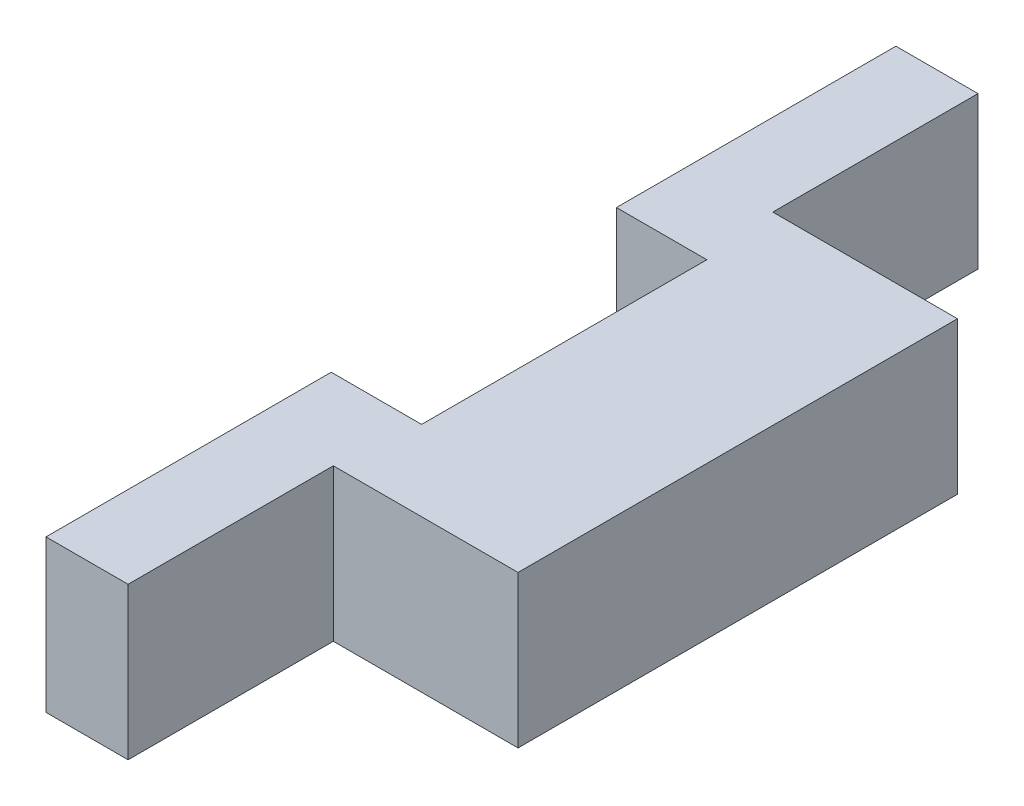
ISO-10303-21;
HEADER;
FILE_DESCRIPTION(('STEP AP214'),'2;1');
FILE_NAME('part.step','',(''),(''),'','','');
FILE_SCHEMA(('AUTOMOTIVE_DESIGN { 1 0 10303 214 1 1 1 1 }'));
ENDSEC;
DATA;
#1=APPLICATION_CONTEXT('core data for automotive mechanical design processes');
#2=APPLICATION_PROTOCOL_DEFINITION('international standard','automotive_design',2000,#1);
#3=PRODUCT_CONTEXT('',#1,'mechanical');
#4=PRODUCT('Part','Part','',(#3));
#5=PRODUCT_RELATED_PRODUCT_CATEGORY('part','',(#4));
#6=PRODUCT_DEFINITION_FORMATION('','',#4);
#7=PRODUCT_DEFINITION_CONTEXT('part definition',#1,'design');
#8=PRODUCT_DEFINITION('design','',#6,#7);
#9=PRODUCT_DEFINITION_SHAPE('','',#8);
#10=(LENGTH_UNIT() NAMED_UNIT(*) SI_UNIT(.MILLI.,.METRE.));
#11=(NAMED_UNIT(*) PLANE_ANGLE_UNIT() SI_UNIT($,.RADIAN.));
#12=(NAMED_UNIT(*) SI_UNIT($,.STERADIAN.) SOLID_ANGLE_UNIT());
#13=UNCERTAINTY_MEASURE_WITH_UNIT(LENGTH_MEASURE(1.E-05),#10,'distance_accuracy_value','');
#14=(GEOMETRIC_REPRESENTATION_CONTEXT(3) GLOBAL_UNCERTAINTY_ASSIGNED_CONTEXT((#13)) GLOBAL_UNIT_ASSIGNED_CONTEXT((#10,
#11,#12)) REPRESENTATION_CONTEXT('',''));
#15=CARTESIAN_POINT('',(0.,0.,0.));
#16=DIRECTION('',(0.,0.,1.));
#17=DIRECTION('',(1.,0.,0.));
#18=AXIS2_PLACEMENT_3D('',#15,#16,#17);
#19=CARTESIAN_POINT('',(0.,0.,0.));
#20=DIRECTION('',(1.,0.,0.));
#21=DIRECTION('',(0.,0.,-1.));
#22=AXIS2_PLACEMENT_3D('',#19,#20,#21);
#23=PLANE('',#22);
#24=DIRECTION('',(0.,0.,-1.));
#25=VECTOR('',#24,1.);
#26=CARTESIAN_POINT('',(0.,-1.52870370370371,0.));
#27=LINE('',#26,#25);
#28=CARTESIAN_POINT('',(0.,-1.52870370370371,2.23643659960877));
#29=VERTEX_POINT('',#28);
#30=CARTESIAN_POINT('',(0.,-1.52870370370371,-15.0564816987482));
#31=VERTEX_POINT('',#30);
#32=EDGE_CURVE('E202',#29,#31,#27,.T.);
#33=ORIENTED_EDGE('',*,*,#32,.F.);
#34=DIRECTION('',(0.,1.,0.));
#35=VECTOR('',#34,1.);
#36=CARTESIAN_POINT('',(0.,0.,2.23643659960877));
#37=LINE('',#36,#35);
#38=CARTESIAN_POINT('',(0.,7.87870370370371,2.23643659960877));
#39=VERTEX_POINT('',#38);
#40=EDGE_CURVE('E43',#29,#39,#37,.T.);
#41=ORIENTED_EDGE('',*,*,#40,.T.);
#42=DIRECTION('',(0.,0.,-1.));
#43=VECTOR('',#42,1.);
#44=CARTESIAN_POINT('',(0.,7.87870370370371,0.));
#45=LINE('',#44,#43);
#46=CARTESIAN_POINT('',(0.,7.87870370370371,-15.0564816987482));
#47=VERTEX_POINT('',#46);
#48=EDGE_CURVE('E187',#39,#47,#45,.T.);
#49=ORIENTED_EDGE('',*,*,#48,.T.);
#50=DIRECTION('',(0.,-1.,0.));
#51=VECTOR('',#50,1.);
#52=CARTESIAN_POINT('',(0.,0.,-15.0564816987482));
#53=LINE('',#52,#51);
#54=EDGE_CURVE('E150',#47,#31,#53,.T.);
#55=ORIENTED_EDGE('',*,*,#54,.T.);
#56=EDGE_LOOP('',(#33,#41,#49,#55));
#57=FACE_BOUND('',#56,.T.);
#58=ADVANCED_FACE('F35',(#57),#23,.F.);
#59=CARTESIAN_POINT('',(16.51,0.,-2.35648169874822));
#60=DIRECTION('',(0.,0.,-1.));
#61=DIRECTION('',(-1.,0.,0.));
#62=AXIS2_PLACEMENT_3D('',#59,#60,#61);
#63=PLANE('',#62);
#64=DIRECTION('',(0.,-1.,0.));
#65=VECTOR('',#64,1.);
#66=CARTESIAN_POINT('',(5.08,0.,-2.35648169874822));
#67=LINE('',#66,#65);
#68=CARTESIAN_POINT('',(5.08,7.87870370370371,-2.35648169874822));
#69=VERTEX_POINT('',#68);
#70=CARTESIAN_POINT('',(5.08,-1.52870370370371,-2.35648169874822));
#71=VERTEX_POINT('',#70);
#72=EDGE_CURVE('E58',#69,#71,#67,.T.);
#73=ORIENTED_EDGE('',*,*,#72,.F.);
#74=DIRECTION('',(-1.,0.,0.));
#75=VECTOR('',#74,1.);
#76=CARTESIAN_POINT('',(16.51,7.87870370370371,-2.35648169874822));
#77=LINE('',#76,#75);
#78=CARTESIAN_POINT('',(16.51,7.87870370370371,-2.35648169874822));
#79=VERTEX_POINT('',#78);
#80=EDGE_CURVE('E211',#79,#69,#77,.T.);
#81=ORIENTED_EDGE('',*,*,#80,.F.);
#82=DIRECTION('',(0.,-1.,0.));
#83=VECTOR('',#82,1.);
#84=CARTESIAN_POINT('',(16.51,0.,-2.35648169874822));
#85=LINE('',#84,#83);
#86=CARTESIAN_POINT('',(16.51,-1.52870370370371,-2.35648169874822));
#87=VERTEX_POINT('',#86);
#88=EDGE_CURVE('E188',#79,#87,#85,.T.);
#89=ORIENTED_EDGE('',*,*,#88,.T.);
#90=DIRECTION('',(-1.,0.,0.));
#91=VECTOR('',#90,1.);
#92=CARTESIAN_POINT('',(16.51,-1.52870370370371,-2.35648169874822));
#93=LINE('',#92,#91);
#94=EDGE_CURVE('E198',#87,#71,#93,.T.);
#95=ORIENTED_EDGE('',*,*,#94,.T.);
#96=EDGE_LOOP('',(#73,#81,#89,#95));
#97=FACE_BOUND('',#96,.T.);
#98=ADVANCED_FACE('F37',(#97),#63,.T.);
#99=CARTESIAN_POINT('',(16.51,7.87870370370371,0.));
#100=DIRECTION('',(0.,1.,0.));
#101=DIRECTION('',(0.,0.,1.));
#102=AXIS2_PLACEMENT_3D('',#99,#100,#101);
#103=PLANE('',#102);
#104=DIRECTION('',(-1.,0.,0.));
#105=VECTOR('',#104,1.);
#106=CARTESIAN_POINT('',(16.51,7.87870370370371,2.23643659960877));
#107=LINE('',#106,#105);
#108=CARTESIAN_POINT('',(5.5940136523447,7.87870370370371,2.23643659960877));
#109=VERTEX_POINT('',#108);
#110=EDGE_CURVE('E146',#109,#39,#107,.T.);
#111=ORIENTED_EDGE('',*,*,#110,.F.);
#112=DIRECTION('',(0.,0.,-1.));
#113=VECTOR('',#112,1.);
#114=CARTESIAN_POINT('',(5.5940136523447,7.87870370370371,0.));
#115=LINE('',#114,#113);
#116=CARTESIAN_POINT('',(5.5940136523447,7.87870370370371,19.8876460390556));
#117=VERTEX_POINT('',#116);
#118=EDGE_CURVE('E148',#117,#109,#115,.T.);
#119=ORIENTED_EDGE('',*,*,#118,.F.);
#120=DIRECTION('',(1.,0.,0.));
#121=VECTOR('',#120,1.);
#122=CARTESIAN_POINT('',(16.51,7.87870370370371,19.8876460390556));
#123=LINE('',#122,#121);
#124=CARTESIAN_POINT('',(0.,7.87870370370371,19.8876460390556));
#125=VERTEX_POINT('',#124);
#126=EDGE_CURVE('E134',#125,#117,#123,.T.);
#127=ORIENTED_EDGE('',*,*,#126,.F.);
#128=CARTESIAN_POINT('',(0.,7.87870370370371,37.5353625170999));
#129=VERTEX_POINT('',#128);
#130=EDGE_CURVE('E199',#129,#125,#45,.T.);
#131=ORIENTED_EDGE('',*,*,#130,.F.);
#132=DIRECTION('',(-1.,0.,0.));
#133=VECTOR('',#132,1.);
#134=CARTESIAN_POINT('',(5.08,7.87870370370371,37.5353625170999));
#135=LINE('',#134,#133);
#136=CARTESIAN_POINT('',(5.08,7.87870370370371,37.5353625170999));
#137=VERTEX_POINT('',#136);
#138=EDGE_CURVE('E180',#137,#129,#135,.T.);
#139=ORIENTED_EDGE('',*,*,#138,.F.);
#140=DIRECTION('',(0.,0.,-1.));
#141=VECTOR('',#140,1.);
#142=CARTESIAN_POINT('',(5.08,7.87870370370371,0.));
#143=LINE('',#142,#141);
#144=CARTESIAN_POINT('',(5.08,7.87870370370371,24.8353625170999));
#145=VERTEX_POINT('',#144);
#146=EDGE_CURVE('E177',#137,#145,#143,.T.);
#147=ORIENTED_EDGE('',*,*,#146,.T.);
#148=DIRECTION('',(-1.,0.,0.));
#149=VECTOR('',#148,1.);
#150=CARTESIAN_POINT('',(16.51,7.87870370370371,24.8353625170999));
#151=LINE('',#150,#149);
#152=CARTESIAN_POINT('',(16.51,7.87870370370371,24.8353625170999));
#153=VERTEX_POINT('',#152);
#154=EDGE_CURVE('E208',#153,#145,#151,.T.);
#155=ORIENTED_EDGE('',*,*,#154,.F.);
#156=DIRECTION('',(0.,0.,-1.));
#157=VECTOR('',#156,1.);
#158=CARTESIAN_POINT('',(16.51,7.87870370370371,0.));
#159=LINE('',#158,#157);
#160=EDGE_CURVE('E191',#153,#79,#159,.T.);
#161=ORIENTED_EDGE('',*,*,#160,.T.);
#162=ORIENTED_EDGE('',*,*,#80,.T.);
#163=DIRECTION('',(0.,0.,-1.));
#164=VECTOR('',#163,1.);
#165=CARTESIAN_POINT('',(5.08,7.87870370370371,0.));
#166=LINE('',#165,#164);
#167=CARTESIAN_POINT('',(5.08,7.87870370370371,-15.0564816987482));
#168=VERTEX_POINT('',#167);
#169=EDGE_CURVE('E151',#69,#168,#166,.T.);
#170=ORIENTED_EDGE('',*,*,#169,.T.);
#171=DIRECTION('',(-1.,0.,0.));
#172=VECTOR('',#171,1.);
#173=CARTESIAN_POINT('',(5.08,7.87870370370371,-15.0564816987482));
#174=LINE('',#173,#172);
#175=EDGE_CURVE('E160',#168,#47,#174,.T.);
#176=ORIENTED_EDGE('',*,*,#175,.T.);
#177=ORIENTED_EDGE('',*,*,#48,.F.);
#178=EDGE_LOOP('',(#111,#119,#127,#131,#139,#147,#155,#161,#162,#170,#176,#177));
#179=FACE_BOUND('',#178,.T.);
#180=ADVANCED_FACE('F221',(#179),#103,.T.);
#181=CARTESIAN_POINT('',(16.51,0.,24.8353625170999));
#182=DIRECTION('',(0.,0.,-1.));
#183=DIRECTION('',(-1.,0.,0.));
#184=AXIS2_PLACEMENT_3D('',#181,#182,#183);
#185=PLANE('',#184);
#186=ORIENTED_EDGE('',*,*,#154,.T.);
#187=DIRECTION('',(0.,-1.,0.));
#188=VECTOR('',#187,1.);
#189=CARTESIAN_POINT('',(5.08,0.,24.8353625170999));
#190=LINE('',#189,#188);
#191=CARTESIAN_POINT('',(5.08,-1.5287037037037,24.8353625170999));
#192=VERTEX_POINT('',#191);
#193=EDGE_CURVE('E174',#145,#192,#190,.T.);
#194=ORIENTED_EDGE('',*,*,#193,.T.);
#195=DIRECTION('',(-1.,0.,0.));
#196=VECTOR('',#195,1.);
#197=CARTESIAN_POINT('',(16.51,-1.5287037037037,24.8353625170999));
#198=LINE('',#197,#196);
#199=CARTESIAN_POINT('',(16.51,-1.5287037037037,24.8353625170999));
#200=VERTEX_POINT('',#199);
#201=EDGE_CURVE('E205',#200,#192,#198,.T.);
#202=ORIENTED_EDGE('',*,*,#201,.F.);
#203=DIRECTION('',(0.,-1.,0.));
#204=VECTOR('',#203,1.);
#205=CARTESIAN_POINT('',(16.51,0.,24.8353625170999));
#206=LINE('',#205,#204);
#207=EDGE_CURVE('E194',#153,#200,#206,.T.);
#208=ORIENTED_EDGE('',*,*,#207,.F.);
#209=EDGE_LOOP('',(#186,#194,#202,#208));
#210=FACE_BOUND('',#209,.T.);
#211=ADVANCED_FACE('F267',(#210),#185,.F.);
#212=CARTESIAN_POINT('',(16.51,-1.52870370370371,0.));
#213=DIRECTION('',(0.,1.,0.));
#214=DIRECTION('',(0.,0.,1.));
#215=AXIS2_PLACEMENT_3D('',#212,#213,#214);
#216=PLANE('',#215);
#217=DIRECTION('',(0.,0.,-1.));
#218=VECTOR('',#217,1.);
#219=CARTESIAN_POINT('',(5.5940136523447,-1.52870370370371,0.));
#220=LINE('',#219,#218);
#221=CARTESIAN_POINT('',(5.5940136523447,-1.52870370370371,19.8876460390556));
#222=VERTEX_POINT('',#221);
#223=CARTESIAN_POINT('',(5.5940136523447,-1.52870370370371,2.23643659960877));
#224=VERTEX_POINT('',#223);
#225=EDGE_CURVE('E11',#222,#224,#220,.T.);
#226=ORIENTED_EDGE('',*,*,#225,.T.);
#227=DIRECTION('',(-1.,0.,0.));
#228=VECTOR('',#227,1.);
#229=CARTESIAN_POINT('',(16.51,-1.52870370370371,2.23643659960877));
#230=LINE('',#229,#228);
#231=EDGE_CURVE('E141',#224,#29,#230,.T.);
#232=ORIENTED_EDGE('',*,*,#231,.T.);
#233=ORIENTED_EDGE('',*,*,#32,.T.);
#234=DIRECTION('',(-1.,0.,0.));
#235=VECTOR('',#234,1.);
#236=CARTESIAN_POINT('',(5.08,-1.52870370370371,-15.0564816987482));
#237=LINE('',#236,#235);
#238=CARTESIAN_POINT('',(5.08,-1.52870370370371,-15.0564816987482));
#239=VERTEX_POINT('',#238);
#240=EDGE_CURVE('E165',#239,#31,#237,.T.);
#241=ORIENTED_EDGE('',*,*,#240,.F.);
#242=DIRECTION('',(0.,0.,-1.));
#243=VECTOR('',#242,1.);
#244=CARTESIAN_POINT('',(5.08,-1.52870370370371,0.));
#245=LINE('',#244,#243);
#246=EDGE_CURVE('E155',#71,#239,#245,.T.);
#247=ORIENTED_EDGE('',*,*,#246,.F.);
#248=ORIENTED_EDGE('',*,*,#94,.F.);
#249=DIRECTION('',(0.,0.,-1.));
#250=VECTOR('',#249,1.);
#251=CARTESIAN_POINT('',(16.51,-1.52870370370371,0.));
#252=LINE('',#251,#250);
#253=EDGE_CURVE('E196',#200,#87,#252,.T.);
#254=ORIENTED_EDGE('',*,*,#253,.F.);
#255=ORIENTED_EDGE('',*,*,#201,.T.);
#256=DIRECTION('',(0.,0.,-1.));
#257=VECTOR('',#256,1.);
#258=CARTESIAN_POINT('',(5.08,-1.52870370370371,0.));
#259=LINE('',#258,#257);
#260=CARTESIAN_POINT('',(5.08,-1.5287037037037,37.5353625170999));
#261=VERTEX_POINT('',#260);
#262=EDGE_CURVE('E172',#261,#192,#259,.T.);
#263=ORIENTED_EDGE('',*,*,#262,.F.);
#264=DIRECTION('',(-1.,0.,0.));
#265=VECTOR('',#264,1.);
#266=CARTESIAN_POINT('',(5.08,-1.5287037037037,37.5353625170999));
#267=LINE('',#266,#265);
#268=CARTESIAN_POINT('',(0.,-1.5287037037037,37.5353625170999));
#269=VERTEX_POINT('',#268);
#270=EDGE_CURVE('E185',#261,#269,#267,.T.);
#271=ORIENTED_EDGE('',*,*,#270,.T.);
#272=CARTESIAN_POINT('',(0.,-1.52870370370371,19.8876460390556));
#273=VERTEX_POINT('',#272);
#274=EDGE_CURVE('E139',#269,#273,#27,.T.);
#275=ORIENTED_EDGE('',*,*,#274,.T.);
#276=DIRECTION('',(1.,0.,0.));
#277=VECTOR('',#276,1.);
#278=CARTESIAN_POINT('',(16.51,-1.52870370370371,19.8876460390556));
#279=LINE('',#278,#277);
#280=EDGE_CURVE('E50',#273,#222,#279,.T.);
#281=ORIENTED_EDGE('',*,*,#280,.T.);
#282=EDGE_LOOP('',(#226,#232,#233,#241,#247,#248,#254,#255,#263,#271,#275,#281));
#283=FACE_BOUND('',#282,.T.);
#284=ADVANCED_FACE('F137',(#283),#216,.F.);
#285=CARTESIAN_POINT('',(16.51,0.,0.));
#286=DIRECTION('',(1.,0.,0.));
#287=DIRECTION('',(0.,0.,-1.));
#288=AXIS2_PLACEMENT_3D('',#285,#286,#287);
#289=PLANE('',#288);
#290=ORIENTED_EDGE('',*,*,#88,.F.);
#291=ORIENTED_EDGE('',*,*,#160,.F.);
#292=ORIENTED_EDGE('',*,*,#207,.T.);
#293=ORIENTED_EDGE('',*,*,#253,.T.);
#294=EDGE_LOOP('',(#290,#291,#292,#293));
#295=FACE_BOUND('',#294,.T.);
#296=ADVANCED_FACE('F250',(#295),#289,.T.);
#297=ORIENTED_EDGE('',*,*,#130,.T.);
#298=DIRECTION('',(0.,-1.,0.));
#299=VECTOR('',#298,1.);
#300=CARTESIAN_POINT('',(0.,0.,19.8876460390556));
#301=LINE('',#300,#299);
#302=EDGE_CURVE('E213',#125,#273,#301,.T.);
#303=ORIENTED_EDGE('',*,*,#302,.T.);
#304=ORIENTED_EDGE('',*,*,#274,.F.);
#305=DIRECTION('',(0.,-1.,0.));
#306=VECTOR('',#305,1.);
#307=CARTESIAN_POINT('',(0.,0.,37.5353625170999));
#308=LINE('',#307,#306);
#309=EDGE_CURVE('E168',#129,#269,#308,.T.);
#310=ORIENTED_EDGE('',*,*,#309,.F.);
#311=EDGE_LOOP('',(#297,#303,#304,#310));
#312=FACE_BOUND('',#311,.T.);
#313=ADVANCED_FACE('F242',(#312),#23,.F.);
#314=CARTESIAN_POINT('',(5.08,0.,37.5353625170999));
#315=DIRECTION('',(0.,0.,-1.));
#316=DIRECTION('',(-1.,0.,0.));
#317=AXIS2_PLACEMENT_3D('',#314,#315,#316);
#318=PLANE('',#317);
#319=ORIENTED_EDGE('',*,*,#309,.T.);
#320=ORIENTED_EDGE('',*,*,#270,.F.);
#321=DIRECTION('',(0.,-1.,0.));
#322=VECTOR('',#321,1.);
#323=CARTESIAN_POINT('',(5.08,0.,37.5353625170999));
#324=LINE('',#323,#322);
#325=EDGE_CURVE('E169',#137,#261,#324,.T.);
#326=ORIENTED_EDGE('',*,*,#325,.F.);
#327=ORIENTED_EDGE('',*,*,#138,.T.);
#328=EDGE_LOOP('',(#319,#320,#326,#327));
#329=FACE_BOUND('',#328,.T.);
#330=ADVANCED_FACE('F249',(#329),#318,.F.);
#331=CARTESIAN_POINT('',(5.08,0.,0.));
#332=DIRECTION('',(1.,0.,0.));
#333=DIRECTION('',(0.,0.,-1.));
#334=AXIS2_PLACEMENT_3D('',#331,#332,#333);
#335=PLANE('',#334);
#336=ORIENTED_EDGE('',*,*,#325,.T.);
#337=ORIENTED_EDGE('',*,*,#262,.T.);
#338=ORIENTED_EDGE('',*,*,#193,.F.);
#339=ORIENTED_EDGE('',*,*,#146,.F.);
#340=EDGE_LOOP('',(#336,#337,#338,#339));
#341=FACE_BOUND('',#340,.T.);
#342=ADVANCED_FACE('F256',(#341),#335,.T.);
#343=CARTESIAN_POINT('',(5.08,0.,-15.0564816987482));
#344=DIRECTION('',(0.,0.,-1.));
#345=DIRECTION('',(0.,1.,0.));
#346=AXIS2_PLACEMENT_3D('',#343,#344,#345);
#347=PLANE('',#346);
#348=ORIENTED_EDGE('',*,*,#54,.F.);
#349=ORIENTED_EDGE('',*,*,#175,.F.);
#350=DIRECTION('',(0.,-1.,0.));
#351=VECTOR('',#350,1.);
#352=CARTESIAN_POINT('',(5.08,0.,-15.0564816987482));
#353=LINE('',#352,#351);
#354=EDGE_CURVE('E157',#168,#239,#353,.T.);
#355=ORIENTED_EDGE('',*,*,#354,.T.);
#356=ORIENTED_EDGE('',*,*,#240,.T.);
#357=EDGE_LOOP('',(#348,#349,#355,#356));
#358=FACE_BOUND('',#357,.T.);
#359=ADVANCED_FACE('F226',(#358),#347,.T.);
#360=CARTESIAN_POINT('',(5.08,0.,0.));
#361=DIRECTION('',(1.,0.,0.));
#362=DIRECTION('',(0.,0.,-1.));
#363=AXIS2_PLACEMENT_3D('',#360,#361,#362);
#364=PLANE('',#363);
#365=ORIENTED_EDGE('',*,*,#169,.F.);
#366=ORIENTED_EDGE('',*,*,#72,.T.);
#367=ORIENTED_EDGE('',*,*,#246,.T.);
#368=ORIENTED_EDGE('',*,*,#354,.F.);
#369=EDGE_LOOP('',(#365,#366,#367,#368));
#370=FACE_BOUND('',#369,.T.);
#371=ADVANCED_FACE('F238',(#370),#364,.T.);
#372=CARTESIAN_POINT('',(5.5940136523447,-20.828,2.23643659960877));
#373=DIRECTION('',(1.,0.,0.));
#374=DIRECTION('',(0.,0.,-1.));
#375=AXIS2_PLACEMENT_3D('',#372,#373,#374);
#376=PLANE('',#375);
#377=ORIENTED_EDGE('',*,*,#118,.T.);
#378=DIRECTION('',(0.,1.,0.));
#379=VECTOR('',#378,1.);
#380=CARTESIAN_POINT('',(5.5940136523447,-20.828,2.23643659960877));
#381=LINE('',#380,#379);
#382=EDGE_CURVE('E129',#224,#109,#381,.T.);
#383=ORIENTED_EDGE('',*,*,#382,.F.);
#384=ORIENTED_EDGE('',*,*,#225,.F.);
#385=DIRECTION('',(0.,1.,0.));
#386=VECTOR('',#385,1.);
#387=CARTESIAN_POINT('',(5.5940136523447,-20.828,19.8876460390556));
#388=LINE('',#387,#386);
#389=EDGE_CURVE('E126',#222,#117,#388,.T.);
#390=ORIENTED_EDGE('',*,*,#389,.T.);
#391=EDGE_LOOP('',(#377,#383,#384,#390));
#392=FACE_BOUND('',#391,.T.);
#393=ADVANCED_FACE('F125',(#392),#376,.F.);
#394=CARTESIAN_POINT('',(0.,-20.828,2.23643659960877));
#395=DIRECTION('',(0.,0.,-1.));
#396=DIRECTION('',(-1.,0.,0.));
#397=AXIS2_PLACEMENT_3D('',#394,#395,#396);
#398=PLANE('',#397);
#399=ORIENTED_EDGE('',*,*,#110,.T.);
#400=ORIENTED_EDGE('',*,*,#40,.F.);
#401=ORIENTED_EDGE('',*,*,#231,.F.);
#402=ORIENTED_EDGE('',*,*,#382,.T.);
#403=EDGE_LOOP('',(#399,#400,#401,#402));
#404=FACE_BOUND('',#403,.T.);
#405=ADVANCED_FACE('F230',(#404),#398,.F.);
#406=CARTESIAN_POINT('',(0.,-20.828,19.8876460390556));
#407=DIRECTION('',(0.,0.,1.));
#408=DIRECTION('',(1.,0.,0.));
#409=AXIS2_PLACEMENT_3D('',#406,#407,#408);
#410=PLANE('',#409);
#411=ORIENTED_EDGE('',*,*,#126,.T.);
#412=ORIENTED_EDGE('',*,*,#389,.F.);
#413=ORIENTED_EDGE('',*,*,#280,.F.);
#414=ORIENTED_EDGE('',*,*,#302,.F.);
#415=EDGE_LOOP('',(#411,#412,#413,#414));
#416=FACE_BOUND('',#415,.T.);
#417=ADVANCED_FACE('F132',(#416),#410,.F.);
#418=CLOSED_SHELL('',(#58,#98,#180,#211,#284,#296,#313,#330,#342,#359,#371,#393,#405,#417));
#419=MANIFOLD_SOLID_BREP('B2',#418);
#420=ADVANCED_BREP_SHAPE_REPRESENTATION('',(#18,#419),#14);
#421=SHAPE_DEFINITION_REPRESENTATION(#9,#420);
ENDSEC;
END-ISO-10303-21;
